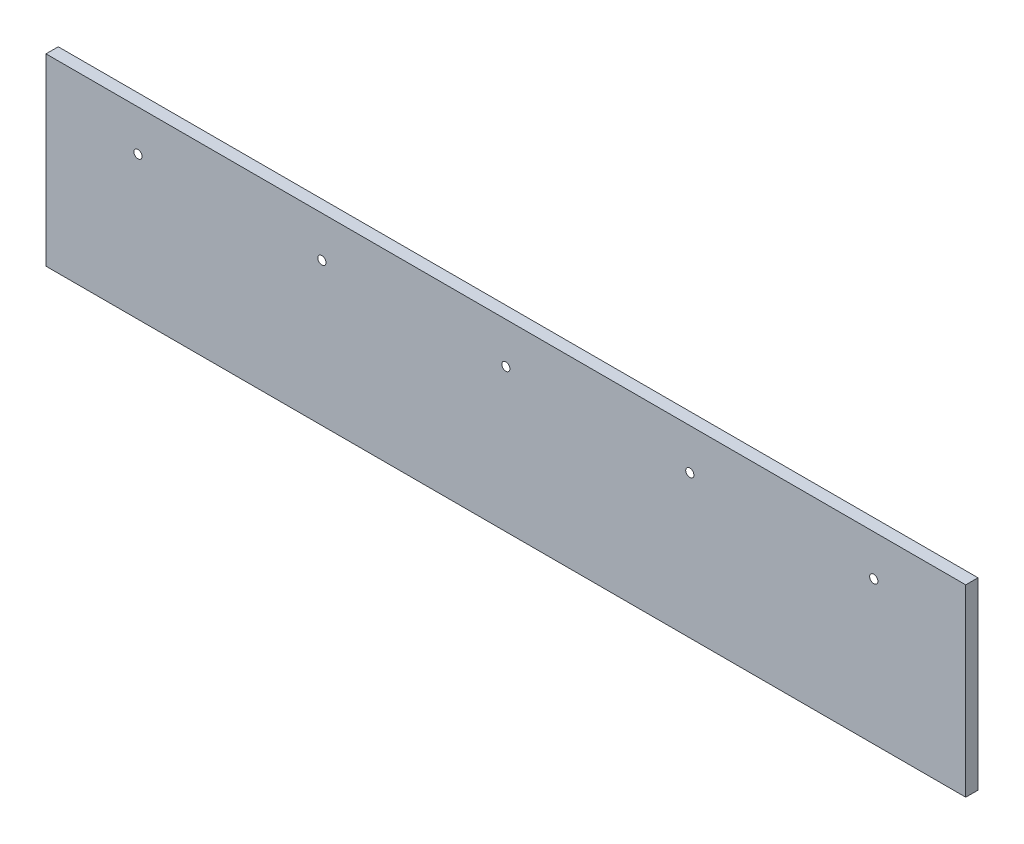
ISO-10303-21;
HEADER;
FILE_DESCRIPTION(('STEP AP214'),'2;1');
FILE_NAME('part.step','',(''),(''),'','','');
FILE_SCHEMA(('AUTOMOTIVE_DESIGN { 1 0 10303 214 1 1 1 1 }'));
ENDSEC;
DATA;
#1=APPLICATION_CONTEXT('core data for automotive mechanical design processes');
#2=APPLICATION_PROTOCOL_DEFINITION('international standard','automotive_design',2000,#1);
#3=PRODUCT_CONTEXT('',#1,'mechanical');
#4=PRODUCT('Part','Part','',(#3));
#5=PRODUCT_RELATED_PRODUCT_CATEGORY('part','',(#4));
#6=PRODUCT_DEFINITION_FORMATION('','',#4);
#7=PRODUCT_DEFINITION_CONTEXT('part definition',#1,'design');
#8=PRODUCT_DEFINITION('design','',#6,#7);
#9=PRODUCT_DEFINITION_SHAPE('','',#8);
#10=(LENGTH_UNIT() NAMED_UNIT(*) SI_UNIT(.MILLI.,.METRE.));
#11=(NAMED_UNIT(*) PLANE_ANGLE_UNIT() SI_UNIT($,.RADIAN.));
#12=(NAMED_UNIT(*) SI_UNIT($,.STERADIAN.) SOLID_ANGLE_UNIT());
#13=UNCERTAINTY_MEASURE_WITH_UNIT(LENGTH_MEASURE(1.E-05),#10,'distance_accuracy_value','');
#14=(GEOMETRIC_REPRESENTATION_CONTEXT(3) GLOBAL_UNCERTAINTY_ASSIGNED_CONTEXT((#13)) GLOBAL_UNIT_ASSIGNED_CONTEXT((#10,
#11,#12)) REPRESENTATION_CONTEXT('',''));
#15=CARTESIAN_POINT('',(0.,0.,0.));
#16=DIRECTION('',(0.,0.,1.));
#17=DIRECTION('',(1.,0.,0.));
#18=AXIS2_PLACEMENT_3D('',#15,#16,#17);
#19=CARTESIAN_POINT('',(0.,-22.5,3.));
#20=DIRECTION('',(0.,1.,0.));
#21=DIRECTION('',(0.,0.,1.));
#22=AXIS2_PLACEMENT_3D('',#19,#20,#21);
#23=PLANE('',#22);
#24=DIRECTION('',(1.,0.,0.));
#25=VECTOR('',#24,1.);
#26=CARTESIAN_POINT('',(0.,-22.5,0.));
#27=LINE('',#26,#25);
#28=CARTESIAN_POINT('',(-112.5,-22.5,0.));
#29=VERTEX_POINT('',#28);
#30=CARTESIAN_POINT('',(112.5,-22.5,0.));
#31=VERTEX_POINT('',#30);
#32=EDGE_CURVE('E106',#29,#31,#27,.T.);
#33=ORIENTED_EDGE('',*,*,#32,.T.);
#34=DIRECTION('',(0.,0.,-1.));
#35=VECTOR('',#34,1.);
#36=CARTESIAN_POINT('',(112.5,-22.5,3.));
#37=LINE('',#36,#35);
#38=CARTESIAN_POINT('',(112.5,-22.5,3.));
#39=VERTEX_POINT('',#38);
#40=EDGE_CURVE('E11',#39,#31,#37,.T.);
#41=ORIENTED_EDGE('',*,*,#40,.F.);
#42=DIRECTION('',(1.,0.,0.));
#43=VECTOR('',#42,1.);
#44=CARTESIAN_POINT('',(0.,-22.5,3.));
#45=LINE('',#44,#43);
#46=CARTESIAN_POINT('',(-112.5,-22.5,3.));
#47=VERTEX_POINT('',#46);
#48=EDGE_CURVE('E91',#47,#39,#45,.T.);
#49=ORIENTED_EDGE('',*,*,#48,.F.);
#50=DIRECTION('',(0.,0.,-1.));
#51=VECTOR('',#50,1.);
#52=CARTESIAN_POINT('',(-112.5,-22.5,3.));
#53=LINE('',#52,#51);
#54=EDGE_CURVE('E58',#47,#29,#53,.T.);
#55=ORIENTED_EDGE('',*,*,#54,.T.);
#56=EDGE_LOOP('',(#33,#41,#49,#55));
#57=FACE_BOUND('',#56,.T.);
#58=ADVANCED_FACE('F39',(#57),#23,.F.);
#59=CARTESIAN_POINT('',(112.5,0.,3.));
#60=DIRECTION('',(-1.,0.,0.));
#61=DIRECTION('',(0.,0.,1.));
#62=AXIS2_PLACEMENT_3D('',#59,#60,#61);
#63=PLANE('',#62);
#64=DIRECTION('',(0.,1.,0.));
#65=VECTOR('',#64,1.);
#66=CARTESIAN_POINT('',(112.5,0.,0.));
#67=LINE('',#66,#65);
#68=CARTESIAN_POINT('',(112.5,22.5,0.));
#69=VERTEX_POINT('',#68);
#70=EDGE_CURVE('E96',#31,#69,#67,.T.);
#71=ORIENTED_EDGE('',*,*,#70,.T.);
#72=DIRECTION('',(0.,0.,-1.));
#73=VECTOR('',#72,1.);
#74=CARTESIAN_POINT('',(112.5,22.5,3.));
#75=LINE('',#74,#73);
#76=CARTESIAN_POINT('',(112.5,22.5,3.));
#77=VERTEX_POINT('',#76);
#78=EDGE_CURVE('E49',#77,#69,#75,.T.);
#79=ORIENTED_EDGE('',*,*,#78,.F.);
#80=DIRECTION('',(0.,1.,0.));
#81=VECTOR('',#80,1.);
#82=CARTESIAN_POINT('',(112.5,0.,3.));
#83=LINE('',#82,#81);
#84=EDGE_CURVE('E83',#39,#77,#83,.T.);
#85=ORIENTED_EDGE('',*,*,#84,.F.);
#86=ORIENTED_EDGE('',*,*,#40,.T.);
#87=EDGE_LOOP('',(#71,#79,#85,#86));
#88=FACE_BOUND('',#87,.T.);
#89=ADVANCED_FACE('F95',(#88),#63,.F.);
#90=CARTESIAN_POINT('',(0.,22.5,3.));
#91=DIRECTION('',(0.,1.,0.));
#92=DIRECTION('',(0.,0.,1.));
#93=AXIS2_PLACEMENT_3D('',#90,#91,#92);
#94=PLANE('',#93);
#95=DIRECTION('',(1.,0.,0.));
#96=VECTOR('',#95,1.);
#97=CARTESIAN_POINT('',(0.,22.5,0.));
#98=LINE('',#97,#96);
#99=CARTESIAN_POINT('',(-112.5,22.5,0.));
#100=VERTEX_POINT('',#99);
#101=EDGE_CURVE('E110',#100,#69,#98,.T.);
#102=ORIENTED_EDGE('',*,*,#101,.F.);
#103=DIRECTION('',(0.,0.,-1.));
#104=VECTOR('',#103,1.);
#105=CARTESIAN_POINT('',(-112.5,22.5,3.));
#106=LINE('',#105,#104);
#107=CARTESIAN_POINT('',(-112.5,22.5,3.));
#108=VERTEX_POINT('',#107);
#109=EDGE_CURVE('E72',#108,#100,#106,.T.);
#110=ORIENTED_EDGE('',*,*,#109,.F.);
#111=DIRECTION('',(1.,0.,0.));
#112=VECTOR('',#111,1.);
#113=CARTESIAN_POINT('',(0.,22.5,3.));
#114=LINE('',#113,#112);
#115=EDGE_CURVE('E90',#108,#77,#114,.T.);
#116=ORIENTED_EDGE('',*,*,#115,.T.);
#117=ORIENTED_EDGE('',*,*,#78,.T.);
#118=EDGE_LOOP('',(#102,#110,#116,#117));
#119=FACE_BOUND('',#118,.T.);
#120=ADVANCED_FACE('F100',(#119),#94,.T.);
#121=CARTESIAN_POINT('',(0.,12.5,3.));
#122=DIRECTION('',(0.,0.,-1.));
#123=DIRECTION('',(1.,0.,0.));
#124=AXIS2_PLACEMENT_3D('',#121,#122,#123);
#125=CONICAL_SURFACE('',#124,1.,1.0471975511966);
#126=CARTESIAN_POINT('',(0.,12.5,3.));
#127=DIRECTION('',(0.,0.,1.));
#128=DIRECTION('',(1.,0.,0.));
#129=AXIS2_PLACEMENT_3D('',#126,#127,#128);
#130=CIRCLE('',#129,1.);
#131=CARTESIAN_POINT('',(1.,12.5,3.));
#132=VERTEX_POINT('',#131);
#133=EDGE_CURVE('E185',#132,#132,#130,.T.);
#134=CARTESIAN_POINT('',(0.,12.5,0.));
#135=DIRECTION('',(0.,0.,1.));
#136=DIRECTION('',(1.,0.,0.));
#137=AXIS2_PLACEMENT_3D('',#134,#135,#136);
#138=CIRCLE('',#137,6.19615242270666);
#139=CARTESIAN_POINT('',(6.19615242270666,12.5,0.));
#140=VERTEX_POINT('',#139);
#141=EDGE_CURVE('E108',#140,#140,#138,.T.);
#142=CARTESIAN_POINT('',(1.,12.5,3.));
#143=CARTESIAN_POINT('',(1.05412658773653,12.5,2.96875));
#144=CARTESIAN_POINT('',(1.10825317547306,12.5,2.9375));
#145=CARTESIAN_POINT('',(1.21650635094611,12.5,2.875));
#146=CARTESIAN_POINT('',(1.27063293868264,12.5,2.84375));
#147=CARTESIAN_POINT('',(1.37888611415569,12.5,2.78125));
#148=CARTESIAN_POINT('',(1.43301270189222,12.5,2.75));
#149=CARTESIAN_POINT('',(1.54126587736528,12.5,2.6875));
#150=CARTESIAN_POINT('',(1.59539246510181,12.5,2.65625));
#151=CARTESIAN_POINT('',(1.70364564057486,12.5,2.59375));
#152=CARTESIAN_POINT('',(1.75777222831139,12.5,2.5625));
#153=CARTESIAN_POINT('',(1.86602540378444,12.5,2.5));
#154=CARTESIAN_POINT('',(1.92015199152097,12.5,2.46875));
#155=CARTESIAN_POINT('',(2.02840516699403,12.5,2.40625));
#156=CARTESIAN_POINT('',(2.08253175473055,12.5,2.375));
#157=CARTESIAN_POINT('',(2.19078493020361,12.5,2.3125));
#158=CARTESIAN_POINT('',(2.24491151794014,12.5,2.28125));
#159=CARTESIAN_POINT('',(2.35316469341319,12.5,2.21875));
#160=CARTESIAN_POINT('',(2.40729128114972,12.5,2.1875));
#161=CARTESIAN_POINT('',(2.51554445662278,12.5,2.125));
#162=CARTESIAN_POINT('',(2.5696710443593,12.5,2.09375));
#163=CARTESIAN_POINT('',(2.67792421983236,12.5,2.03125));
#164=CARTESIAN_POINT('',(2.73205080756889,12.5,2.));
#165=CARTESIAN_POINT('',(2.84030398304194,12.5,1.9375));
#166=CARTESIAN_POINT('',(2.89443057077847,12.5,1.90625));
#167=CARTESIAN_POINT('',(3.00268374625153,12.5,1.84375));
#168=CARTESIAN_POINT('',(3.05681033398805,12.5,1.8125));
#169=CARTESIAN_POINT('',(3.16506350946111,12.5,1.75));
#170=CARTESIAN_POINT('',(3.21919009719764,12.5,1.71875));
#171=CARTESIAN_POINT('',(3.32744327267069,12.5,1.65625));
#172=CARTESIAN_POINT('',(3.38156986040722,12.5,1.625));
#173=CARTESIAN_POINT('',(3.48982303588027,12.5,1.5625));
#174=CARTESIAN_POINT('',(3.5439496236168,12.5,1.53125));
#175=CARTESIAN_POINT('',(3.65220279908986,12.5,1.46875));
#176=CARTESIAN_POINT('',(3.70632938682639,12.5,1.4375));
#177=CARTESIAN_POINT('',(3.81458256229944,12.5,1.375));
#178=CARTESIAN_POINT('',(3.86870915003597,12.5,1.34375));
#179=CARTESIAN_POINT('',(3.97696232550902,12.5,1.28125));
#180=CARTESIAN_POINT('',(4.03108891324555,12.5,1.25));
#181=CARTESIAN_POINT('',(4.13934208871861,12.5,1.1875));
#182=CARTESIAN_POINT('',(4.19346867645513,12.5,1.15625));
#183=CARTESIAN_POINT('',(4.30172185192819,12.5,1.09375));
#184=CARTESIAN_POINT('',(4.35584843966472,12.5,1.0625));
#185=CARTESIAN_POINT('',(4.46410161513777,12.5,1.));
#186=CARTESIAN_POINT('',(4.5182282028743,12.5,0.96875));
#187=CARTESIAN_POINT('',(4.62648137834736,12.5,0.90625));
#188=CARTESIAN_POINT('',(4.68060796608388,12.5,0.875));
#189=CARTESIAN_POINT('',(4.78886114155694,12.5,0.8125));
#190=CARTESIAN_POINT('',(4.84298772929347,12.5,0.78125));
#191=CARTESIAN_POINT('',(4.95124090476652,12.5,0.71875));
#192=CARTESIAN_POINT('',(5.00536749250305,12.5,0.6875));
#193=CARTESIAN_POINT('',(5.1136206679761,12.5,0.625));
#194=CARTESIAN_POINT('',(5.16774725571263,12.5,0.59375));
#195=CARTESIAN_POINT('',(5.27600043118569,12.5,0.53125));
#196=CARTESIAN_POINT('',(5.33012701892222,12.5,0.5));
#197=CARTESIAN_POINT('',(5.43838019439527,12.5,0.4375));
#198=CARTESIAN_POINT('',(5.4925067821318,12.5,0.40625));
#199=CARTESIAN_POINT('',(5.60075995760486,12.5,0.34375));
#200=CARTESIAN_POINT('',(5.65488654534138,12.5,0.3125));
#201=CARTESIAN_POINT('',(5.76313972081444,12.5,0.25));
#202=CARTESIAN_POINT('',(5.81726630855097,12.5,0.21875));
#203=CARTESIAN_POINT('',(5.92551948402402,12.5,0.15625));
#204=CARTESIAN_POINT('',(5.97964607176055,12.5,0.125));
#205=CARTESIAN_POINT('',(6.0878992472336,12.5,0.0625));
#206=CARTESIAN_POINT('',(6.14202583497013,12.5,0.0312499999999999));
#207=CARTESIAN_POINT('',(6.19615242270666,12.5,0.));
#208=B_SPLINE_CURVE_WITH_KNOTS('',3,(#142,#143,#144,#145,#146,#147,#148,#149,#150,#151,#152,
#153,#154,#155,#156,#157,#158,#159,#160,#161,#162,#163,#164,#165,#166,#167,#168,#169,#170,#171,
#172,#173,#174,#175,#176,#177,#178,#179,#180,#181,#182,#183,#184,#185,#186,#187,#188,#189,#190,
#191,#192,#193,#194,#195,#196,#197,#198,#199,#200,#201,#202,#203,#204,#205,#206,#207),
.UNSPECIFIED.,.F.,.F.,(4,2,2,2,2,2,2,2,2,2,2,2,2,2,2,2,2,2,2,2,2,2,2,2,2,2,2,2,2,2,2,2,4),(0.,
0.187500000000001,0.375000000000002,0.562500000000002,0.750000000000003,0.937500000000004,1.125,
1.31250000000001,1.50000000000001,1.68750000000001,1.87500000000001,2.06250000000001,
2.25000000000001,2.43750000000001,2.62500000000001,2.81250000000001,3.00000000000001,
3.18750000000001,3.37500000000001,3.56250000000001,3.75000000000001,3.93750000000002,
4.12500000000002,4.31250000000002,4.50000000000002,4.68750000000002,4.87500000000002,
5.06250000000002,5.25000000000002,5.43750000000002,5.62500000000002,5.81250000000002,
6.00000000000003),.UNSPECIFIED.);
#209=EDGE_CURVE('BSEAM137',#132,#140,#208,.T.);
#210=ORIENTED_EDGE('',*,*,#133,.T.);
#211=ORIENTED_EDGE('',*,*,#141,.F.);
#212=ORIENTED_EDGE('',*,*,#209,.T.);
#213=ORIENTED_EDGE('',*,*,#209,.F.);
#214=EDGE_LOOP('',(#210,#212,#211,#213));
#215=FACE_BOUND('',#214,.T.);
#216=ADVANCED_FACE('F137',(#215),#125,.F.);
#217=CARTESIAN_POINT('',(45.,12.5,3.));
#218=DIRECTION('',(0.,0.,-1.));
#219=DIRECTION('',(1.,0.,0.));
#220=AXIS2_PLACEMENT_3D('',#217,#218,#219);
#221=CONICAL_SURFACE('',#220,0.999999999999998,1.0471975511966);
#222=CARTESIAN_POINT('',(45.,12.5,3.));
#223=DIRECTION('',(0.,0.,1.));
#224=DIRECTION('',(1.,0.,0.));
#225=AXIS2_PLACEMENT_3D('',#222,#223,#224);
#226=CIRCLE('',#225,0.999999999999998);
#227=CARTESIAN_POINT('',(46.,12.5,3.));
#228=VERTEX_POINT('',#227);
#229=EDGE_CURVE('E182',#228,#228,#226,.T.);
#230=CARTESIAN_POINT('',(45.,12.5,0.));
#231=DIRECTION('',(0.,0.,1.));
#232=DIRECTION('',(1.,0.,0.));
#233=AXIS2_PLACEMENT_3D('',#230,#231,#232);
#234=CIRCLE('',#233,6.19615242270666);
#235=CARTESIAN_POINT('',(51.1961524227067,12.5,0.));
#236=VERTEX_POINT('',#235);
#237=EDGE_CURVE('E43',#236,#236,#234,.T.);
#238=CARTESIAN_POINT('',(46.,12.5,3.));
#239=CARTESIAN_POINT('',(46.0541265877365,12.5,2.96875));
#240=CARTESIAN_POINT('',(46.1082531754731,12.5,2.9375));
#241=CARTESIAN_POINT('',(46.2165063509461,12.5,2.875));
#242=CARTESIAN_POINT('',(46.2706329386826,12.5,2.84375));
#243=CARTESIAN_POINT('',(46.3788861141557,12.5,2.78125));
#244=CARTESIAN_POINT('',(46.4330127018922,12.5,2.75));
#245=CARTESIAN_POINT('',(46.5412658773653,12.5,2.6875));
#246=CARTESIAN_POINT('',(46.5953924651018,12.5,2.65625));
#247=CARTESIAN_POINT('',(46.7036456405749,12.5,2.59375));
#248=CARTESIAN_POINT('',(46.7577722283114,12.5,2.5625));
#249=CARTESIAN_POINT('',(46.8660254037844,12.5,2.5));
#250=CARTESIAN_POINT('',(46.920151991521,12.5,2.46875));
#251=CARTESIAN_POINT('',(47.028405166994,12.5,2.40625));
#252=CARTESIAN_POINT('',(47.0825317547306,12.5,2.375));
#253=CARTESIAN_POINT('',(47.1907849302036,12.5,2.3125));
#254=CARTESIAN_POINT('',(47.2449115179401,12.5,2.28125));
#255=CARTESIAN_POINT('',(47.3531646934132,12.5,2.21875));
#256=CARTESIAN_POINT('',(47.4072912811497,12.5,2.1875));
#257=CARTESIAN_POINT('',(47.5155444566228,12.5,2.125));
#258=CARTESIAN_POINT('',(47.5696710443593,12.5,2.09375));
#259=CARTESIAN_POINT('',(47.6779242198324,12.5,2.03125));
#260=CARTESIAN_POINT('',(47.7320508075689,12.5,2.));
#261=CARTESIAN_POINT('',(47.8403039830419,12.5,1.9375));
#262=CARTESIAN_POINT('',(47.8944305707785,12.5,1.90625));
#263=CARTESIAN_POINT('',(48.0026837462515,12.5,1.84375));
#264=CARTESIAN_POINT('',(48.0568103339881,12.5,1.8125));
#265=CARTESIAN_POINT('',(48.1650635094611,12.5,1.75));
#266=CARTESIAN_POINT('',(48.2191900971976,12.5,1.71875));
#267=CARTESIAN_POINT('',(48.3274432726707,12.5,1.65625));
#268=CARTESIAN_POINT('',(48.3815698604072,12.5,1.625));
#269=CARTESIAN_POINT('',(48.4898230358803,12.5,1.5625));
#270=CARTESIAN_POINT('',(48.5439496236168,12.5,1.53125));
#271=CARTESIAN_POINT('',(48.6522027990899,12.5,1.46875));
#272=CARTESIAN_POINT('',(48.7063293868264,12.5,1.4375));
#273=CARTESIAN_POINT('',(48.8145825622994,12.5,1.375));
#274=CARTESIAN_POINT('',(48.868709150036,12.5,1.34375));
#275=CARTESIAN_POINT('',(48.976962325509,12.5,1.28125));
#276=CARTESIAN_POINT('',(49.0310889132455,12.5,1.25));
#277=CARTESIAN_POINT('',(49.1393420887186,12.5,1.1875));
#278=CARTESIAN_POINT('',(49.1934686764551,12.5,1.15625));
#279=CARTESIAN_POINT('',(49.3017218519282,12.5,1.09375));
#280=CARTESIAN_POINT('',(49.3558484396647,12.5,1.0625));
#281=CARTESIAN_POINT('',(49.4641016151378,12.5,1.));
#282=CARTESIAN_POINT('',(49.5182282028743,12.5,0.96875));
#283=CARTESIAN_POINT('',(49.6264813783473,12.5,0.90625));
#284=CARTESIAN_POINT('',(49.6806079660839,12.5,0.875));
#285=CARTESIAN_POINT('',(49.7888611415569,12.5,0.8125));
#286=CARTESIAN_POINT('',(49.8429877292935,12.5,0.78125));
#287=CARTESIAN_POINT('',(49.9512409047665,12.5,0.71875));
#288=CARTESIAN_POINT('',(50.005367492503,12.5,0.6875));
#289=CARTESIAN_POINT('',(50.1136206679761,12.5,0.625));
#290=CARTESIAN_POINT('',(50.1677472557126,12.5,0.59375));
#291=CARTESIAN_POINT('',(50.2760004311857,12.5,0.53125));
#292=CARTESIAN_POINT('',(50.3301270189222,12.5,0.5));
#293=CARTESIAN_POINT('',(50.4383801943953,12.5,0.4375));
#294=CARTESIAN_POINT('',(50.4925067821318,12.5,0.40625));
#295=CARTESIAN_POINT('',(50.6007599576049,12.5,0.34375));
#296=CARTESIAN_POINT('',(50.6548865453414,12.5,0.3125));
#297=CARTESIAN_POINT('',(50.7631397208144,12.5,0.25));
#298=CARTESIAN_POINT('',(50.817266308551,12.5,0.21875));
#299=CARTESIAN_POINT('',(50.925519484024,12.5,0.15625));
#300=CARTESIAN_POINT('',(50.9796460717605,12.5,0.125));
#301=CARTESIAN_POINT('',(51.0878992472336,12.5,0.0625));
#302=CARTESIAN_POINT('',(51.1420258349701,12.5,0.0312499999999999));
#303=CARTESIAN_POINT('',(51.1961524227067,12.5,0.));
#304=B_SPLINE_CURVE_WITH_KNOTS('',3,(#238,#239,#240,#241,#242,#243,#244,#245,#246,#247,#248,
#249,#250,#251,#252,#253,#254,#255,#256,#257,#258,#259,#260,#261,#262,#263,#264,#265,#266,#267,
#268,#269,#270,#271,#272,#273,#274,#275,#276,#277,#278,#279,#280,#281,#282,#283,#284,#285,#286,
#287,#288,#289,#290,#291,#292,#293,#294,#295,#296,#297,#298,#299,#300,#301,#302,#303),
.UNSPECIFIED.,.F.,.F.,(4,2,2,2,2,2,2,2,2,2,2,2,2,2,2,2,2,2,2,2,2,2,2,2,2,2,2,2,2,2,2,2,4),(0.,
0.1875,0.375000000000001,0.562500000000002,0.750000000000003,0.937500000000003,1.125,1.3125,
1.50000000000001,1.68750000000001,1.87500000000001,2.06250000000001,2.25000000000001,
2.43750000000001,2.62500000000001,2.81250000000001,3.00000000000001,3.18750000000001,
3.37500000000001,3.56250000000001,3.75000000000001,3.93750000000001,4.12500000000002,
4.31250000000002,4.50000000000002,4.68750000000002,4.87500000000002,5.06250000000002,
5.25000000000002,5.43750000000002,5.62500000000002,5.81250000000002,6.00000000000002),.UNSPECIFIED.);
#305=EDGE_CURVE('BSEAM134',#228,#236,#304,.T.);
#306=ORIENTED_EDGE('',*,*,#229,.T.);
#307=ORIENTED_EDGE('',*,*,#237,.F.);
#308=ORIENTED_EDGE('',*,*,#305,.T.);
#309=ORIENTED_EDGE('',*,*,#305,.F.);
#310=EDGE_LOOP('',(#306,#308,#307,#309));
#311=FACE_BOUND('',#310,.T.);
#312=ADVANCED_FACE('F134',(#311),#221,.F.);
#313=CARTESIAN_POINT('',(90.,12.5,3.));
#314=DIRECTION('',(0.,0.,-1.));
#315=DIRECTION('',(1.,0.,0.));
#316=AXIS2_PLACEMENT_3D('',#313,#314,#315);
#317=CONICAL_SURFACE('',#316,0.999999999999998,1.0471975511966);
#318=CARTESIAN_POINT('',(90.,12.5,3.));
#319=DIRECTION('',(0.,0.,1.));
#320=DIRECTION('',(1.,0.,0.));
#321=AXIS2_PLACEMENT_3D('',#318,#319,#320);
#322=CIRCLE('',#321,0.999999999999998);
#323=CARTESIAN_POINT('',(91.,12.5,3.));
#324=VERTEX_POINT('',#323);
#325=EDGE_CURVE('E179',#324,#324,#322,.T.);
#326=CARTESIAN_POINT('',(90.,12.5,0.));
#327=DIRECTION('',(0.,0.,1.));
#328=DIRECTION('',(1.,0.,0.));
#329=AXIS2_PLACEMENT_3D('',#326,#327,#328);
#330=CIRCLE('',#329,6.19615242270666);
#331=CARTESIAN_POINT('',(96.1961524227067,12.5,0.));
#332=VERTEX_POINT('',#331);
#333=EDGE_CURVE('E118',#332,#332,#330,.T.);
#334=CARTESIAN_POINT('',(91.,12.5,3.));
#335=CARTESIAN_POINT('',(91.0541265877365,12.5,2.96875));
#336=CARTESIAN_POINT('',(91.1082531754731,12.5,2.9375));
#337=CARTESIAN_POINT('',(91.2165063509461,12.5,2.875));
#338=CARTESIAN_POINT('',(91.2706329386826,12.5,2.84375));
#339=CARTESIAN_POINT('',(91.3788861141557,12.5,2.78125));
#340=CARTESIAN_POINT('',(91.4330127018922,12.5,2.75));
#341=CARTESIAN_POINT('',(91.5412658773653,12.5,2.6875));
#342=CARTESIAN_POINT('',(91.5953924651018,12.5,2.65625));
#343=CARTESIAN_POINT('',(91.7036456405749,12.5,2.59375));
#344=CARTESIAN_POINT('',(91.7577722283114,12.5,2.5625));
#345=CARTESIAN_POINT('',(91.8660254037844,12.5,2.5));
#346=CARTESIAN_POINT('',(91.920151991521,12.5,2.46875));
#347=CARTESIAN_POINT('',(92.028405166994,12.5,2.40625));
#348=CARTESIAN_POINT('',(92.0825317547306,12.5,2.375));
#349=CARTESIAN_POINT('',(92.1907849302036,12.5,2.3125));
#350=CARTESIAN_POINT('',(92.2449115179401,12.5,2.28125));
#351=CARTESIAN_POINT('',(92.3531646934132,12.5,2.21875));
#352=CARTESIAN_POINT('',(92.4072912811497,12.5,2.1875));
#353=CARTESIAN_POINT('',(92.5155444566228,12.5,2.125));
#354=CARTESIAN_POINT('',(92.5696710443593,12.5,2.09375));
#355=CARTESIAN_POINT('',(92.6779242198323,12.5,2.03125));
#356=CARTESIAN_POINT('',(92.7320508075689,12.5,2.));
#357=CARTESIAN_POINT('',(92.8403039830419,12.5,1.9375));
#358=CARTESIAN_POINT('',(92.8944305707785,12.5,1.90625));
#359=CARTESIAN_POINT('',(93.0026837462515,12.5,1.84375));
#360=CARTESIAN_POINT('',(93.0568103339881,12.5,1.8125));
#361=CARTESIAN_POINT('',(93.1650635094611,12.5,1.75));
#362=CARTESIAN_POINT('',(93.2191900971976,12.5,1.71875));
#363=CARTESIAN_POINT('',(93.3274432726707,12.5,1.65625));
#364=CARTESIAN_POINT('',(93.3815698604072,12.5,1.625));
#365=CARTESIAN_POINT('',(93.4898230358803,12.5,1.5625));
#366=CARTESIAN_POINT('',(93.5439496236168,12.5,1.53125));
#367=CARTESIAN_POINT('',(93.6522027990898,12.5,1.46875));
#368=CARTESIAN_POINT('',(93.7063293868264,12.5,1.4375));
#369=CARTESIAN_POINT('',(93.8145825622994,12.5,1.375));
#370=CARTESIAN_POINT('',(93.868709150036,12.5,1.34375));
#371=CARTESIAN_POINT('',(93.976962325509,12.5,1.28125));
#372=CARTESIAN_POINT('',(94.0310889132456,12.5,1.25));
#373=CARTESIAN_POINT('',(94.1393420887186,12.5,1.1875));
#374=CARTESIAN_POINT('',(94.1934686764551,12.5,1.15625));
#375=CARTESIAN_POINT('',(94.3017218519282,12.5,1.09375));
#376=CARTESIAN_POINT('',(94.3558484396647,12.5,1.0625));
#377=CARTESIAN_POINT('',(94.4641016151378,12.5,1.));
#378=CARTESIAN_POINT('',(94.5182282028743,12.5,0.96875));
#379=CARTESIAN_POINT('',(94.6264813783473,12.5,0.90625));
#380=CARTESIAN_POINT('',(94.6806079660839,12.5,0.875));
#381=CARTESIAN_POINT('',(94.7888611415569,12.5,0.8125));
#382=CARTESIAN_POINT('',(94.8429877292935,12.5,0.78125));
#383=CARTESIAN_POINT('',(94.9512409047665,12.5,0.71875));
#384=CARTESIAN_POINT('',(95.005367492503,12.5,0.6875));
#385=CARTESIAN_POINT('',(95.1136206679761,12.5,0.625));
#386=CARTESIAN_POINT('',(95.1677472557126,12.5,0.59375));
#387=CARTESIAN_POINT('',(95.2760004311857,12.5,0.53125));
#388=CARTESIAN_POINT('',(95.3301270189222,12.5,0.5));
#389=CARTESIAN_POINT('',(95.4383801943953,12.5,0.4375));
#390=CARTESIAN_POINT('',(95.4925067821318,12.5,0.40625));
#391=CARTESIAN_POINT('',(95.6007599576049,12.5,0.34375));
#392=CARTESIAN_POINT('',(95.6548865453414,12.5,0.3125));
#393=CARTESIAN_POINT('',(95.7631397208144,12.5,0.25));
#394=CARTESIAN_POINT('',(95.817266308551,12.5,0.21875));
#395=CARTESIAN_POINT('',(95.925519484024,12.5,0.15625));
#396=CARTESIAN_POINT('',(95.9796460717605,12.5,0.125));
#397=CARTESIAN_POINT('',(96.0878992472336,12.5,0.0625));
#398=CARTESIAN_POINT('',(96.1420258349701,12.5,0.0312499999999999));
#399=CARTESIAN_POINT('',(96.1961524227067,12.5,0.));
#400=B_SPLINE_CURVE_WITH_KNOTS('',3,(#334,#335,#336,#337,#338,#339,#340,#341,#342,#343,#344,
#345,#346,#347,#348,#349,#350,#351,#352,#353,#354,#355,#356,#357,#358,#359,#360,#361,#362,#363,
#364,#365,#366,#367,#368,#369,#370,#371,#372,#373,#374,#375,#376,#377,#378,#379,#380,#381,#382,
#383,#384,#385,#386,#387,#388,#389,#390,#391,#392,#393,#394,#395,#396,#397,#398,#399),
.UNSPECIFIED.,.F.,.F.,(4,2,2,2,2,2,2,2,2,2,2,2,2,2,2,2,2,2,2,2,2,2,2,2,2,2,2,2,2,2,2,2,4),(0.,
0.1875,0.375000000000001,0.562500000000002,0.750000000000003,0.937500000000003,1.125,1.3125,
1.50000000000001,1.68750000000001,1.87500000000001,2.06250000000001,2.25000000000001,
2.43750000000001,2.62500000000001,2.81250000000001,3.00000000000001,3.18750000000001,
3.37500000000001,3.56250000000001,3.75000000000001,3.93750000000001,4.12500000000002,
4.31250000000002,4.50000000000002,4.68750000000002,4.87500000000002,5.06250000000002,
5.25000000000002,5.43750000000002,5.62500000000002,5.81250000000002,6.00000000000002),.UNSPECIFIED.);
#401=EDGE_CURVE('BSEAM136',#324,#332,#400,.T.);
#402=ORIENTED_EDGE('',*,*,#325,.T.);
#403=ORIENTED_EDGE('',*,*,#333,.F.);
#404=ORIENTED_EDGE('',*,*,#401,.T.);
#405=ORIENTED_EDGE('',*,*,#401,.F.);
#406=EDGE_LOOP('',(#402,#404,#403,#405));
#407=FACE_BOUND('',#406,.T.);
#408=ADVANCED_FACE('F136',(#407),#317,.F.);
#409=CARTESIAN_POINT('',(-45.,12.5,3.));
#410=DIRECTION('',(0.,0.,-1.));
#411=DIRECTION('',(1.,0.,0.));
#412=AXIS2_PLACEMENT_3D('',#409,#410,#411);
#413=CONICAL_SURFACE('',#412,0.999999999999998,1.0471975511966);
#414=CARTESIAN_POINT('',(-45.,12.5,3.));
#415=DIRECTION('',(0.,0.,1.));
#416=DIRECTION('',(1.,0.,0.));
#417=AXIS2_PLACEMENT_3D('',#414,#415,#416);
#418=CIRCLE('',#417,0.999999999999998);
#419=CARTESIAN_POINT('',(-44.,12.5,3.));
#420=VERTEX_POINT('',#419);
#421=EDGE_CURVE('E175',#420,#420,#418,.T.);
#422=CARTESIAN_POINT('',(-45.,12.5,0.));
#423=DIRECTION('',(0.,0.,1.));
#424=DIRECTION('',(1.,0.,0.));
#425=AXIS2_PLACEMENT_3D('',#422,#423,#424);
#426=CIRCLE('',#425,6.19615242270666);
#427=CARTESIAN_POINT('',(-38.8038475772933,12.5,0.));
#428=VERTEX_POINT('',#427);
#429=EDGE_CURVE('E121',#428,#428,#426,.T.);
#430=CARTESIAN_POINT('',(-44.,12.5,3.));
#431=CARTESIAN_POINT('',(-43.9458734122635,12.5,2.96875));
#432=CARTESIAN_POINT('',(-43.8917468245269,12.5,2.9375));
#433=CARTESIAN_POINT('',(-43.7834936490539,12.5,2.875));
#434=CARTESIAN_POINT('',(-43.7293670613174,12.5,2.84375));
#435=CARTESIAN_POINT('',(-43.6211138858443,12.5,2.78125));
#436=CARTESIAN_POINT('',(-43.5669872981078,12.5,2.75));
#437=CARTESIAN_POINT('',(-43.4587341226347,12.5,2.6875));
#438=CARTESIAN_POINT('',(-43.4046075348982,12.5,2.65625));
#439=CARTESIAN_POINT('',(-43.2963543594251,12.5,2.59375));
#440=CARTESIAN_POINT('',(-43.2422277716886,12.5,2.5625));
#441=CARTESIAN_POINT('',(-43.1339745962156,12.5,2.5));
#442=CARTESIAN_POINT('',(-43.079848008479,12.5,2.46875));
#443=CARTESIAN_POINT('',(-42.971594833006,12.5,2.40625));
#444=CARTESIAN_POINT('',(-42.9174682452694,12.5,2.375));
#445=CARTESIAN_POINT('',(-42.8092150697964,12.5,2.3125));
#446=CARTESIAN_POINT('',(-42.7550884820599,12.5,2.28125));
#447=CARTESIAN_POINT('',(-42.6468353065868,12.5,2.21875));
#448=CARTESIAN_POINT('',(-42.5927087188503,12.5,2.1875));
#449=CARTESIAN_POINT('',(-42.4844555433772,12.5,2.125));
#450=CARTESIAN_POINT('',(-42.4303289556407,12.5,2.09375));
#451=CARTESIAN_POINT('',(-42.3220757801676,12.5,2.03125));
#452=CARTESIAN_POINT('',(-42.2679491924311,12.5,2.));
#453=CARTESIAN_POINT('',(-42.1596960169581,12.5,1.9375));
#454=CARTESIAN_POINT('',(-42.1055694292215,12.5,1.90625));
#455=CARTESIAN_POINT('',(-41.9973162537485,12.5,1.84375));
#456=CARTESIAN_POINT('',(-41.9431896660119,12.5,1.8125));
#457=CARTESIAN_POINT('',(-41.8349364905389,12.5,1.75));
#458=CARTESIAN_POINT('',(-41.7808099028024,12.5,1.71875));
#459=CARTESIAN_POINT('',(-41.6725567273293,12.5,1.65625));
#460=CARTESIAN_POINT('',(-41.6184301395928,12.5,1.625));
#461=CARTESIAN_POINT('',(-41.5101769641197,12.5,1.5625));
#462=CARTESIAN_POINT('',(-41.4560503763832,12.5,1.53125));
#463=CARTESIAN_POINT('',(-41.3477972009101,12.5,1.46875));
#464=CARTESIAN_POINT('',(-41.2936706131736,12.5,1.4375));
#465=CARTESIAN_POINT('',(-41.1854174377006,12.5,1.375));
#466=CARTESIAN_POINT('',(-41.131290849964,12.5,1.34375));
#467=CARTESIAN_POINT('',(-41.023037674491,12.5,1.28125));
#468=CARTESIAN_POINT('',(-40.9689110867544,12.5,1.25));
#469=CARTESIAN_POINT('',(-40.8606579112814,12.5,1.1875));
#470=CARTESIAN_POINT('',(-40.8065313235449,12.5,1.15625));
#471=CARTESIAN_POINT('',(-40.6982781480718,12.5,1.09375));
#472=CARTESIAN_POINT('',(-40.6441515603353,12.5,1.0625));
#473=CARTESIAN_POINT('',(-40.5358983848622,12.5,1.));
#474=CARTESIAN_POINT('',(-40.4817717971257,12.5,0.96875));
#475=CARTESIAN_POINT('',(-40.3735186216526,12.5,0.90625));
#476=CARTESIAN_POINT('',(-40.3193920339161,12.5,0.875));
#477=CARTESIAN_POINT('',(-40.2111388584431,12.5,0.8125));
#478=CARTESIAN_POINT('',(-40.1570122707065,12.5,0.78125));
#479=CARTESIAN_POINT('',(-40.0487590952335,12.5,0.71875));
#480=CARTESIAN_POINT('',(-39.994632507497,12.5,0.6875));
#481=CARTESIAN_POINT('',(-39.8863793320239,12.5,0.625));
#482=CARTESIAN_POINT('',(-39.8322527442874,12.5,0.59375));
#483=CARTESIAN_POINT('',(-39.7239995688143,12.5,0.53125));
#484=CARTESIAN_POINT('',(-39.6698729810778,12.5,0.5));
#485=CARTESIAN_POINT('',(-39.5616198056047,12.5,0.4375));
#486=CARTESIAN_POINT('',(-39.5074932178682,12.5,0.40625));
#487=CARTESIAN_POINT('',(-39.3992400423951,12.5,0.34375));
#488=CARTESIAN_POINT('',(-39.3451134546586,12.5,0.3125));
#489=CARTESIAN_POINT('',(-39.2368602791856,12.5,0.25));
#490=CARTESIAN_POINT('',(-39.182733691449,12.5,0.21875));
#491=CARTESIAN_POINT('',(-39.074480515976,12.5,0.15625));
#492=CARTESIAN_POINT('',(-39.0203539282395,12.5,0.125));
#493=CARTESIAN_POINT('',(-38.9121007527664,12.5,0.0625));
#494=CARTESIAN_POINT('',(-38.8579741650299,12.5,0.0312499999999999));
#495=CARTESIAN_POINT('',(-38.8038475772933,12.5,0.));
#496=B_SPLINE_CURVE_WITH_KNOTS('',3,(#430,#431,#432,#433,#434,#435,#436,#437,#438,#439,#440,
#441,#442,#443,#444,#445,#446,#447,#448,#449,#450,#451,#452,#453,#454,#455,#456,#457,#458,#459,
#460,#461,#462,#463,#464,#465,#466,#467,#468,#469,#470,#471,#472,#473,#474,#475,#476,#477,#478,
#479,#480,#481,#482,#483,#484,#485,#486,#487,#488,#489,#490,#491,#492,#493,#494,#495),
.UNSPECIFIED.,.F.,.F.,(4,2,2,2,2,2,2,2,2,2,2,2,2,2,2,2,2,2,2,2,2,2,2,2,2,2,2,2,2,2,2,2,4),(0.,
0.1875,0.375000000000001,0.562500000000002,0.750000000000003,0.937500000000003,1.125,1.3125,
1.50000000000001,1.68750000000001,1.87500000000001,2.06250000000001,2.25000000000001,
2.43750000000001,2.62500000000001,2.81250000000001,3.00000000000001,3.18750000000001,
3.37500000000001,3.56250000000001,3.75000000000001,3.93750000000001,4.12500000000002,
4.31250000000002,4.50000000000002,4.68750000000002,4.87500000000002,5.06250000000002,
5.25000000000002,5.43750000000002,5.62500000000002,5.81250000000002,6.00000000000002),.UNSPECIFIED.);
#497=EDGE_CURVE('BSEAM144',#420,#428,#496,.T.);
#498=ORIENTED_EDGE('',*,*,#421,.T.);
#499=ORIENTED_EDGE('',*,*,#429,.F.);
#500=ORIENTED_EDGE('',*,*,#497,.T.);
#501=ORIENTED_EDGE('',*,*,#497,.F.);
#502=EDGE_LOOP('',(#498,#500,#499,#501));
#503=FACE_BOUND('',#502,.T.);
#504=ADVANCED_FACE('F144',(#503),#413,.F.);
#505=CARTESIAN_POINT('',(-90.,12.5,3.));
#506=DIRECTION('',(0.,0.,-1.));
#507=DIRECTION('',(1.,0.,0.));
#508=AXIS2_PLACEMENT_3D('',#505,#506,#507);
#509=CONICAL_SURFACE('',#508,0.999999999999998,1.0471975511966);
#510=CARTESIAN_POINT('',(-90.,12.5,3.));
#511=DIRECTION('',(0.,0.,1.));
#512=DIRECTION('',(1.,0.,0.));
#513=AXIS2_PLACEMENT_3D('',#510,#511,#512);
#514=CIRCLE('',#513,0.999999999999998);
#515=CARTESIAN_POINT('',(-89.,12.5,3.));
#516=VERTEX_POINT('',#515);
#517=EDGE_CURVE('E115',#516,#516,#514,.T.);
#518=CARTESIAN_POINT('',(-90.,12.5,0.));
#519=DIRECTION('',(0.,0.,1.));
#520=DIRECTION('',(1.,0.,0.));
#521=AXIS2_PLACEMENT_3D('',#518,#519,#520);
#522=CIRCLE('',#521,6.19615242270666);
#523=CARTESIAN_POINT('',(-83.8038475772933,12.5,0.));
#524=VERTEX_POINT('',#523);
#525=EDGE_CURVE('E122',#524,#524,#522,.T.);
#526=CARTESIAN_POINT('',(-89.,12.5,3.));
#527=CARTESIAN_POINT('',(-88.9458734122635,12.5,2.96875));
#528=CARTESIAN_POINT('',(-88.8917468245269,12.5,2.9375));
#529=CARTESIAN_POINT('',(-88.7834936490539,12.5,2.875));
#530=CARTESIAN_POINT('',(-88.7293670613174,12.5,2.84375));
#531=CARTESIAN_POINT('',(-88.6211138858443,12.5,2.78125));
#532=CARTESIAN_POINT('',(-88.5669872981078,12.5,2.75));
#533=CARTESIAN_POINT('',(-88.4587341226347,12.5,2.6875));
#534=CARTESIAN_POINT('',(-88.4046075348982,12.5,2.65625));
#535=CARTESIAN_POINT('',(-88.2963543594251,12.5,2.59375));
#536=CARTESIAN_POINT('',(-88.2422277716886,12.5,2.5625));
#537=CARTESIAN_POINT('',(-88.1339745962156,12.5,2.5));
#538=CARTESIAN_POINT('',(-88.079848008479,12.5,2.46875));
#539=CARTESIAN_POINT('',(-87.971594833006,12.5,2.40625));
#540=CARTESIAN_POINT('',(-87.9174682452694,12.5,2.375));
#541=CARTESIAN_POINT('',(-87.8092150697964,12.5,2.3125));
#542=CARTESIAN_POINT('',(-87.7550884820599,12.5,2.28125));
#543=CARTESIAN_POINT('',(-87.6468353065868,12.5,2.21875));
#544=CARTESIAN_POINT('',(-87.5927087188503,12.5,2.1875));
#545=CARTESIAN_POINT('',(-87.4844555433772,12.5,2.125));
#546=CARTESIAN_POINT('',(-87.4303289556407,12.5,2.09375));
#547=CARTESIAN_POINT('',(-87.3220757801676,12.5,2.03125));
#548=CARTESIAN_POINT('',(-87.2679491924311,12.5,2.));
#549=CARTESIAN_POINT('',(-87.1596960169581,12.5,1.9375));
#550=CARTESIAN_POINT('',(-87.1055694292215,12.5,1.90625));
#551=CARTESIAN_POINT('',(-86.9973162537485,12.5,1.84375));
#552=CARTESIAN_POINT('',(-86.9431896660119,12.5,1.8125));
#553=CARTESIAN_POINT('',(-86.8349364905389,12.5,1.75));
#554=CARTESIAN_POINT('',(-86.7808099028024,12.5,1.71875));
#555=CARTESIAN_POINT('',(-86.6725567273293,12.5,1.65625));
#556=CARTESIAN_POINT('',(-86.6184301395928,12.5,1.625));
#557=CARTESIAN_POINT('',(-86.5101769641197,12.5,1.5625));
#558=CARTESIAN_POINT('',(-86.4560503763832,12.5,1.53125));
#559=CARTESIAN_POINT('',(-86.3477972009101,12.5,1.46875));
#560=CARTESIAN_POINT('',(-86.2936706131736,12.5,1.4375));
#561=CARTESIAN_POINT('',(-86.1854174377006,12.5,1.375));
#562=CARTESIAN_POINT('',(-86.131290849964,12.5,1.34375));
#563=CARTESIAN_POINT('',(-86.023037674491,12.5,1.28125));
#564=CARTESIAN_POINT('',(-85.9689110867544,12.5,1.25));
#565=CARTESIAN_POINT('',(-85.8606579112814,12.5,1.1875));
#566=CARTESIAN_POINT('',(-85.8065313235449,12.5,1.15625));
#567=CARTESIAN_POINT('',(-85.6982781480718,12.5,1.09375));
#568=CARTESIAN_POINT('',(-85.6441515603353,12.5,1.0625));
#569=CARTESIAN_POINT('',(-85.5358983848622,12.5,1.));
#570=CARTESIAN_POINT('',(-85.4817717971257,12.5,0.96875));
#571=CARTESIAN_POINT('',(-85.3735186216526,12.5,0.90625));
#572=CARTESIAN_POINT('',(-85.3193920339161,12.5,0.875));
#573=CARTESIAN_POINT('',(-85.2111388584431,12.5,0.8125));
#574=CARTESIAN_POINT('',(-85.1570122707065,12.5,0.78125));
#575=CARTESIAN_POINT('',(-85.0487590952335,12.5,0.71875));
#576=CARTESIAN_POINT('',(-84.9946325074969,12.5,0.6875));
#577=CARTESIAN_POINT('',(-84.8863793320239,12.5,0.625));
#578=CARTESIAN_POINT('',(-84.8322527442874,12.5,0.59375));
#579=CARTESIAN_POINT('',(-84.7239995688143,12.5,0.53125));
#580=CARTESIAN_POINT('',(-84.6698729810778,12.5,0.5));
#581=CARTESIAN_POINT('',(-84.5616198056047,12.5,0.4375));
#582=CARTESIAN_POINT('',(-84.5074932178682,12.5,0.40625));
#583=CARTESIAN_POINT('',(-84.3992400423951,12.5,0.34375));
#584=CARTESIAN_POINT('',(-84.3451134546586,12.5,0.3125));
#585=CARTESIAN_POINT('',(-84.2368602791856,12.5,0.25));
#586=CARTESIAN_POINT('',(-84.182733691449,12.5,0.21875));
#587=CARTESIAN_POINT('',(-84.074480515976,12.5,0.15625));
#588=CARTESIAN_POINT('',(-84.0203539282394,12.5,0.125));
#589=CARTESIAN_POINT('',(-83.9121007527664,12.5,0.0625));
#590=CARTESIAN_POINT('',(-83.8579741650299,12.5,0.0312499999999999));
#591=CARTESIAN_POINT('',(-83.8038475772933,12.5,0.));
#592=B_SPLINE_CURVE_WITH_KNOTS('',3,(#526,#527,#528,#529,#530,#531,#532,#533,#534,#535,#536,
#537,#538,#539,#540,#541,#542,#543,#544,#545,#546,#547,#548,#549,#550,#551,#552,#553,#554,#555,
#556,#557,#558,#559,#560,#561,#562,#563,#564,#565,#566,#567,#568,#569,#570,#571,#572,#573,#574,
#575,#576,#577,#578,#579,#580,#581,#582,#583,#584,#585,#586,#587,#588,#589,#590,#591),
.UNSPECIFIED.,.F.,.F.,(4,2,2,2,2,2,2,2,2,2,2,2,2,2,2,2,2,2,2,2,2,2,2,2,2,2,2,2,2,2,2,2,4),(0.,
0.1875,0.375000000000001,0.562500000000002,0.750000000000003,0.937500000000003,1.125,1.3125,
1.50000000000001,1.68750000000001,1.87500000000001,2.06250000000001,2.25000000000001,
2.43750000000001,2.62500000000001,2.81250000000001,3.00000000000001,3.18750000000001,
3.37500000000001,3.56250000000001,3.75000000000001,3.93750000000001,4.12500000000002,
4.31250000000002,4.50000000000002,4.68750000000002,4.87500000000002,5.06250000000002,
5.25000000000002,5.43750000000002,5.62500000000002,5.81250000000002,6.00000000000002),.UNSPECIFIED.);
#593=EDGE_CURVE('BSEAM41',#516,#524,#592,.T.);
#594=ORIENTED_EDGE('',*,*,#517,.T.);
#595=ORIENTED_EDGE('',*,*,#525,.F.);
#596=ORIENTED_EDGE('',*,*,#593,.T.);
#597=ORIENTED_EDGE('',*,*,#593,.F.);
#598=EDGE_LOOP('',(#594,#596,#595,#597));
#599=FACE_BOUND('',#598,.T.);
#600=ADVANCED_FACE('F41',(#599),#509,.F.);
#601=CARTESIAN_POINT('',(-112.5,0.,3.));
#602=DIRECTION('',(-1.,0.,0.));
#603=DIRECTION('',(0.,0.,1.));
#604=AXIS2_PLACEMENT_3D('',#601,#602,#603);
#605=PLANE('',#604);
#606=DIRECTION('',(0.,1.,0.));
#607=VECTOR('',#606,1.);
#608=CARTESIAN_POINT('',(-112.5,0.,0.));
#609=LINE('',#608,#607);
#610=EDGE_CURVE('E112',#29,#100,#609,.T.);
#611=ORIENTED_EDGE('',*,*,#610,.F.);
#612=ORIENTED_EDGE('',*,*,#54,.F.);
#613=DIRECTION('',(0.,1.,0.));
#614=VECTOR('',#613,1.);
#615=CARTESIAN_POINT('',(-112.5,0.,3.));
#616=LINE('',#615,#614);
#617=EDGE_CURVE('E101',#47,#108,#616,.T.);
#618=ORIENTED_EDGE('',*,*,#617,.T.);
#619=ORIENTED_EDGE('',*,*,#109,.T.);
#620=EDGE_LOOP('',(#611,#612,#618,#619));
#621=FACE_BOUND('',#620,.T.);
#622=ADVANCED_FACE('F159',(#621),#605,.T.);
#623=CARTESIAN_POINT('',(0.,0.,3.));
#624=DIRECTION('',(0.,0.,1.));
#625=DIRECTION('',(1.,0.,0.));
#626=AXIS2_PLACEMENT_3D('',#623,#624,#625);
#627=PLANE('',#626);
#628=ORIENTED_EDGE('',*,*,#517,.F.);
#629=EDGE_LOOP('',(#628));
#630=FACE_BOUND('',#629,.T.);
#631=ORIENTED_EDGE('',*,*,#421,.F.);
#632=EDGE_LOOP('',(#631));
#633=FACE_BOUND('',#632,.T.);
#634=ORIENTED_EDGE('',*,*,#325,.F.);
#635=EDGE_LOOP('',(#634));
#636=FACE_BOUND('',#635,.T.);
#637=ORIENTED_EDGE('',*,*,#229,.F.);
#638=EDGE_LOOP('',(#637));
#639=FACE_BOUND('',#638,.T.);
#640=ORIENTED_EDGE('',*,*,#133,.F.);
#641=EDGE_LOOP('',(#640));
#642=FACE_BOUND('',#641,.T.);
#643=ORIENTED_EDGE('',*,*,#48,.T.);
#644=ORIENTED_EDGE('',*,*,#84,.T.);
#645=ORIENTED_EDGE('',*,*,#115,.F.);
#646=ORIENTED_EDGE('',*,*,#617,.F.);
#647=EDGE_LOOP('',(#643,#644,#645,#646));
#648=FACE_BOUND('',#647,.T.);
#649=ADVANCED_FACE('F87',(#630,#633,#636,#639,#642,#648),#627,.T.);
#650=CARTESIAN_POINT('',(0.,0.,0.));
#651=DIRECTION('',(0.,0.,1.));
#652=DIRECTION('',(1.,0.,0.));
#653=AXIS2_PLACEMENT_3D('',#650,#651,#652);
#654=PLANE('',#653);
#655=ORIENTED_EDGE('',*,*,#525,.T.);
#656=EDGE_LOOP('',(#655));
#657=FACE_BOUND('',#656,.T.);
#658=ORIENTED_EDGE('',*,*,#429,.T.);
#659=EDGE_LOOP('',(#658));
#660=FACE_BOUND('',#659,.T.);
#661=ORIENTED_EDGE('',*,*,#333,.T.);
#662=EDGE_LOOP('',(#661));
#663=FACE_BOUND('',#662,.T.);
#664=ORIENTED_EDGE('',*,*,#237,.T.);
#665=EDGE_LOOP('',(#664));
#666=FACE_BOUND('',#665,.T.);
#667=ORIENTED_EDGE('',*,*,#141,.T.);
#668=EDGE_LOOP('',(#667));
#669=FACE_BOUND('',#668,.T.);
#670=ORIENTED_EDGE('',*,*,#32,.F.);
#671=ORIENTED_EDGE('',*,*,#610,.T.);
#672=ORIENTED_EDGE('',*,*,#101,.T.);
#673=ORIENTED_EDGE('',*,*,#70,.F.);
#674=EDGE_LOOP('',(#670,#671,#672,#673));
#675=FACE_BOUND('',#674,.T.);
#676=ADVANCED_FACE('F132',(#657,#660,#663,#666,#669,#675),#654,.F.);
#677=CLOSED_SHELL('',(#58,#89,#120,#216,#312,#408,#504,#600,#622,#649,#676));
#678=MANIFOLD_SOLID_BREP('B2',#677);
#679=ADVANCED_BREP_SHAPE_REPRESENTATION('',(#18,#678),#14);
#680=SHAPE_DEFINITION_REPRESENTATION(#9,#679);
ENDSEC;
END-ISO-10303-21;
